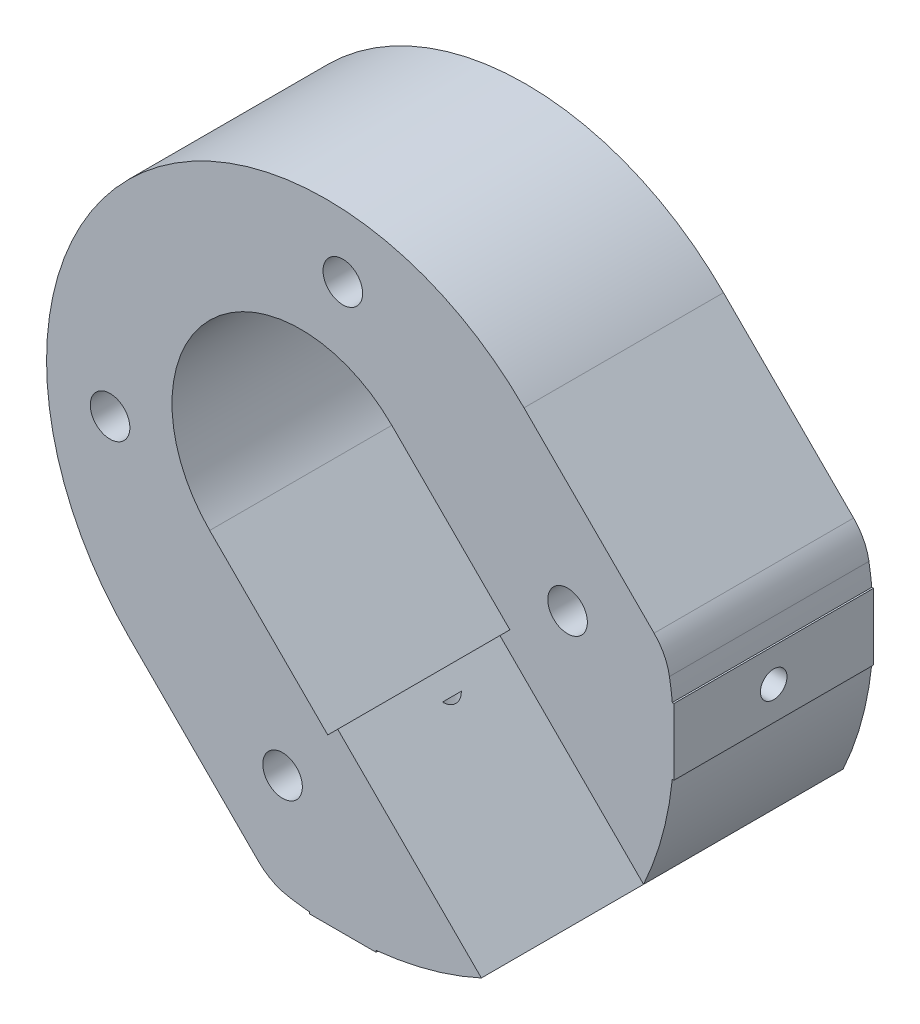
ISO-10303-21;
HEADER;
FILE_DESCRIPTION(('STEP AP214'),'2;1');
FILE_NAME('part.step','',(''),(''),'','','');
FILE_SCHEMA(('AUTOMOTIVE_DESIGN { 1 0 10303 214 1 1 1 1 }'));
ENDSEC;
DATA;
#1=APPLICATION_CONTEXT('core data for automotive mechanical design processes');
#2=APPLICATION_PROTOCOL_DEFINITION('international standard','automotive_design',2000,#1);
#3=PRODUCT_CONTEXT('',#1,'mechanical');
#4=PRODUCT('Part','Part','',(#3));
#5=PRODUCT_RELATED_PRODUCT_CATEGORY('part','',(#4));
#6=PRODUCT_DEFINITION_FORMATION('','',#4);
#7=PRODUCT_DEFINITION_CONTEXT('part definition',#1,'design');
#8=PRODUCT_DEFINITION('design','',#6,#7);
#9=PRODUCT_DEFINITION_SHAPE('','',#8);
#10=(LENGTH_UNIT() NAMED_UNIT(*) SI_UNIT(.MILLI.,.METRE.));
#11=(NAMED_UNIT(*) PLANE_ANGLE_UNIT() SI_UNIT($,.RADIAN.));
#12=(NAMED_UNIT(*) SI_UNIT($,.STERADIAN.) SOLID_ANGLE_UNIT());
#13=UNCERTAINTY_MEASURE_WITH_UNIT(LENGTH_MEASURE(1.E-05),#10,'distance_accuracy_value','');
#14=(GEOMETRIC_REPRESENTATION_CONTEXT(3) GLOBAL_UNCERTAINTY_ASSIGNED_CONTEXT((#13)) GLOBAL_UNIT_ASSIGNED_CONTEXT((#10,
#11,#12)) REPRESENTATION_CONTEXT('',''));
#15=CARTESIAN_POINT('',(0.,0.,0.));
#16=DIRECTION('',(0.,0.,1.));
#17=DIRECTION('',(1.,0.,0.));
#18=AXIS2_PLACEMENT_3D('',#15,#16,#17);
#19=CARTESIAN_POINT('',(20.8397644139722,-45.2349483649082,15.));
#20=DIRECTION('',(-0.707106781186549,-0.707106781186546,0.));
#21=DIRECTION('',(0.707106781186546,-0.707106781186549,0.));
#22=AXIS2_PLACEMENT_3D('',#19,#20,#21);
#23=PLANE('',#22);
#24=DIRECTION('',(0.,0.,-1.));
#25=VECTOR('',#24,1.);
#26=CARTESIAN_POINT('',(20.8397644139722,-45.2349483649082,15.));
#27=LINE('',#26,#25);
#28=CARTESIAN_POINT('',(20.8397644139722,-45.2349483649082,15.));
#29=VERTEX_POINT('',#28);
#30=CARTESIAN_POINT('',(20.8397644139722,-45.2349483649082,-15.));
#31=VERTEX_POINT('',#30);
#32=EDGE_CURVE('E366',#29,#31,#27,.T.);
#33=ORIENTED_EDGE('',*,*,#32,.T.);
#34=DIRECTION('',(-0.707106781186546,0.707106781186549,0.));
#35=VECTOR('',#34,1.);
#36=CARTESIAN_POINT('',(20.8397644139722,-45.2349483649082,-15.));
#37=LINE('',#36,#35);
#38=CARTESIAN_POINT('',(-0.763433331346862,-23.6317506195891,-15.));
#39=VERTEX_POINT('',#38);
#40=EDGE_CURVE('E221',#31,#39,#37,.T.);
#41=ORIENTED_EDGE('',*,*,#40,.T.);
#42=DIRECTION('',(0.,0.,-1.));
#43=VECTOR('',#42,1.);
#44=CARTESIAN_POINT('',(-0.763433331346862,-23.6317506195891,15.));
#45=LINE('',#44,#43);
#46=CARTESIAN_POINT('',(-0.763433331346862,-23.6317506195891,15.));
#47=VERTEX_POINT('',#46);
#48=EDGE_CURVE('E364',#47,#39,#45,.T.);
#49=ORIENTED_EDGE('',*,*,#48,.F.);
#50=DIRECTION('',(-0.707106781186546,0.707106781186549,0.));
#51=VECTOR('',#50,1.);
#52=CARTESIAN_POINT('',(20.8397644139722,-45.2349483649082,15.));
#53=LINE('',#52,#51);
#54=EDGE_CURVE('E286',#29,#47,#53,.T.);
#55=ORIENTED_EDGE('',*,*,#54,.F.);
#56=EDGE_LOOP('',(#33,#41,#49,#55));
#57=FACE_BOUND('',#56,.T.);
#58=CARTESIAN_POINT('',(0.,-24.3951839509359,0.));
#59=DIRECTION('',(-0.707106781186549,-0.707106781186546,0.));
#60=DIRECTION('',(0.707106781186546,-0.707106781186549,0.));
#61=AXIS2_PLACEMENT_3D('',#58,#59,#60);
#62=ELLIPSE('',#61,2.8284271247462,2.);
#63=CARTESIAN_POINT('',(1.40939750906406,-25.80458146,1.41901327035513));
#64=VERTEX_POINT('',#63);
#65=CARTESIAN_POINT('',(1.40939750906406,-25.80458146,-1.41901327035513));
#66=VERTEX_POINT('',#65);
#67=EDGE_CURVE('E212',#64,#66,#62,.F.);
#68=ORIENTED_EDGE('',*,*,#67,.F.);
#69=DIRECTION('',(0.,0.,-1.));
#70=VECTOR('',#69,1.);
#71=CARTESIAN_POINT('',(1.40939750906406,-25.80458146,15.));
#72=LINE('',#71,#70);
#73=EDGE_CURVE('E46',#64,#66,#72,.T.);
#74=ORIENTED_EDGE('',*,*,#73,.T.);
#75=EDGE_LOOP('',(#68,#74));
#76=FACE_BOUND('',#75,.T.);
#77=ADVANCED_FACE('F38',(#57,#76),#23,.F.);
#78=CARTESIAN_POINT('',(5.,-49.5529649406146,15.));
#79=DIRECTION('',(-1.,0.,0.));
#80=DIRECTION('',(0.,-1.,0.));
#81=AXIS2_PLACEMENT_3D('',#78,#79,#80);
#82=PLANE('',#81);
#83=DIRECTION('',(0.,0.,-1.));
#84=VECTOR('',#83,1.);
#85=CARTESIAN_POINT('',(5.,-49.80458146,15.));
#86=LINE('',#85,#84);
#87=CARTESIAN_POINT('',(5.,-49.80458146,15.));
#88=VERTEX_POINT('',#87);
#89=CARTESIAN_POINT('',(5.,-49.80458146,-15.));
#90=VERTEX_POINT('',#89);
#91=EDGE_CURVE('E326',#88,#90,#86,.T.);
#92=ORIENTED_EDGE('',*,*,#91,.T.);
#93=DIRECTION('',(0.,1.,0.));
#94=VECTOR('',#93,1.);
#95=CARTESIAN_POINT('',(5.,-49.5529649406146,-15.));
#96=LINE('',#95,#94);
#97=CARTESIAN_POINT('',(4.99999999999997,-49.5529649406146,-15.));
#98=VERTEX_POINT('',#97);
#99=EDGE_CURVE('E215',#90,#98,#96,.T.);
#100=ORIENTED_EDGE('',*,*,#99,.T.);
#101=DIRECTION('',(0.,0.,-1.));
#102=VECTOR('',#101,1.);
#103=CARTESIAN_POINT('',(4.99999999999997,-49.5529649406146,15.));
#104=LINE('',#103,#102);
#105=CARTESIAN_POINT('',(4.99999999999997,-49.5529649406146,15.));
#106=VERTEX_POINT('',#105);
#107=EDGE_CURVE('E368',#106,#98,#104,.T.);
#108=ORIENTED_EDGE('',*,*,#107,.F.);
#109=DIRECTION('',(0.,1.,0.));
#110=VECTOR('',#109,1.);
#111=CARTESIAN_POINT('',(5.,-49.5529649406146,15.));
#112=LINE('',#111,#110);
#113=EDGE_CURVE('E281',#88,#106,#112,.T.);
#114=ORIENTED_EDGE('',*,*,#113,.F.);
#115=EDGE_LOOP('',(#92,#100,#108,#114));
#116=FACE_BOUND('',#115,.T.);
#117=ADVANCED_FACE('F40',(#116),#82,.F.);
#118=CARTESIAN_POINT('',(0.,0.,15.));
#119=DIRECTION('',(0.,0.,-1.));
#120=DIRECTION('',(-1.,0.,0.));
#121=AXIS2_PLACEMENT_3D('',#118,#119,#120);
#122=CYLINDRICAL_SURFACE('',#121,49.80458146);
#123=ORIENTED_EDGE('',*,*,#107,.T.);
#124=CARTESIAN_POINT('',(0.,0.,-15.));
#125=DIRECTION('',(0.,0.,1.));
#126=DIRECTION('',(1.,0.,0.));
#127=AXIS2_PLACEMENT_3D('',#124,#125,#126);
#128=CIRCLE('',#127,49.80458146);
#129=EDGE_CURVE('E218',#98,#31,#128,.T.);
#130=ORIENTED_EDGE('',*,*,#129,.T.);
#131=ORIENTED_EDGE('',*,*,#32,.F.);
#132=CARTESIAN_POINT('',(0.,0.,15.));
#133=DIRECTION('',(0.,0.,1.));
#134=DIRECTION('',(1.,0.,0.));
#135=AXIS2_PLACEMENT_3D('',#132,#133,#134);
#136=CIRCLE('',#135,49.80458146);
#137=EDGE_CURVE('E284',#106,#29,#136,.T.);
#138=ORIENTED_EDGE('',*,*,#137,.F.);
#139=EDGE_LOOP('',(#123,#130,#131,#138));
#140=FACE_BOUND('',#139,.T.);
#141=ADVANCED_FACE('F396',(#140),#122,.T.);
#142=CARTESIAN_POINT('',(-0.763433331346862,-23.6317506195891,15.));
#143=DIRECTION('',(0.707106781186441,-0.707106781186654,0.));
#144=DIRECTION('',(0.707106781186654,0.707106781186441,0.));
#145=AXIS2_PLACEMENT_3D('',#142,#143,#144);
#146=PLANE('',#145);
#147=ORIENTED_EDGE('',*,*,#48,.T.);
#148=DIRECTION('',(-0.707106781186654,-0.707106781186441,0.));
#149=VECTOR('',#148,1.);
#150=CARTESIAN_POINT('',(-0.763433331346862,-23.6317506195891,-15.));
#151=LINE('',#150,#149);
#152=CARTESIAN_POINT('',(-2.26035594671568,-25.1286732349574,-15.));
#153=VERTEX_POINT('',#152);
#154=EDGE_CURVE('E224',#39,#153,#151,.T.);
#155=ORIENTED_EDGE('',*,*,#154,.T.);
#156=DIRECTION('',(0.,0.,-1.));
#157=VECTOR('',#156,1.);
#158=CARTESIAN_POINT('',(-2.26035594671568,-25.1286732349574,15.));
#159=LINE('',#158,#157);
#160=CARTESIAN_POINT('',(-2.26035594671568,-25.1286732349574,15.));
#161=VERTEX_POINT('',#160);
#162=EDGE_CURVE('E362',#161,#153,#159,.T.);
#163=ORIENTED_EDGE('',*,*,#162,.F.);
#164=DIRECTION('',(-0.707106781186654,-0.707106781186441,0.));
#165=VECTOR('',#164,1.);
#166=CARTESIAN_POINT('',(-0.763433331346862,-23.6317506195891,15.));
#167=LINE('',#166,#165);
#168=EDGE_CURVE('E288',#47,#161,#167,.T.);
#169=ORIENTED_EDGE('',*,*,#168,.F.);
#170=EDGE_LOOP('',(#147,#155,#163,#169));
#171=FACE_BOUND('',#170,.T.);
#172=ADVANCED_FACE('F399',(#171),#146,.F.);
#173=CARTESIAN_POINT('',(-2.26035594671568,-25.1286732349574,15.));
#174=DIRECTION('',(-0.707106781186549,-0.707106781186546,0.));
#175=DIRECTION('',(0.707106781186546,-0.707106781186549,0.));
#176=AXIS2_PLACEMENT_3D('',#173,#174,#175);
#177=PLANE('',#176);
#178=ORIENTED_EDGE('',*,*,#162,.T.);
#179=DIRECTION('',(-0.707106781186546,0.707106781186549,0.));
#180=VECTOR('',#179,1.);
#181=CARTESIAN_POINT('',(-2.26035594671568,-25.1286732349574,-15.));
#182=LINE('',#181,#180);
#183=CARTESIAN_POINT('',(-20.0175175344704,-7.3715116472027,-15.));
#184=VERTEX_POINT('',#183);
#185=EDGE_CURVE('E227',#153,#184,#182,.T.);
#186=ORIENTED_EDGE('',*,*,#185,.T.);
#187=DIRECTION('',(0.,0.,-1.));
#188=VECTOR('',#187,1.);
#189=CARTESIAN_POINT('',(-20.0175175344704,-7.3715116472027,15.));
#190=LINE('',#189,#188);
#191=CARTESIAN_POINT('',(-20.0175175344704,-7.3715116472027,15.));
#192=VERTEX_POINT('',#191);
#193=EDGE_CURVE('E360',#192,#184,#190,.T.);
#194=ORIENTED_EDGE('',*,*,#193,.F.);
#195=DIRECTION('',(-0.707106781186546,0.707106781186549,0.));
#196=VECTOR('',#195,1.);
#197=CARTESIAN_POINT('',(-2.26035594671568,-25.1286732349574,15.));
#198=LINE('',#197,#196);
#199=EDGE_CURVE('E290',#161,#192,#198,.T.);
#200=ORIENTED_EDGE('',*,*,#199,.F.);
#201=EDGE_LOOP('',(#178,#186,#194,#200));
#202=FACE_BOUND('',#201,.T.);
#203=ADVANCED_FACE('F406',(#202),#177,.F.);
#204=CARTESIAN_POINT('',(-6.3230029436338,6.3230029436338,15.));
#205=DIRECTION('',(0.,0.,-1.));
#206=DIRECTION('',(-1.,0.,0.));
#207=AXIS2_PLACEMENT_3D('',#204,#205,#206);
#208=CYLINDRICAL_SURFACE('',#207,19.3669682644773);
#209=ORIENTED_EDGE('',*,*,#193,.T.);
#210=CARTESIAN_POINT('',(-6.3230029436338,6.3230029436338,-15.));
#211=DIRECTION('',(0.,0.,-1.));
#212=DIRECTION('',(1.,0.,0.));
#213=AXIS2_PLACEMENT_3D('',#210,#211,#212);
#214=CIRCLE('',#213,19.3669682644773);
#215=CARTESIAN_POINT('',(7.37151164720273,20.0175175344703,-15.));
#216=VERTEX_POINT('',#215);
#217=EDGE_CURVE('E230',#184,#216,#214,.T.);
#218=ORIENTED_EDGE('',*,*,#217,.T.);
#219=DIRECTION('',(0.,0.,-1.));
#220=VECTOR('',#219,1.);
#221=CARTESIAN_POINT('',(7.37151164720273,20.0175175344703,15.));
#222=LINE('',#221,#220);
#223=CARTESIAN_POINT('',(7.37151164720273,20.0175175344703,15.));
#224=VERTEX_POINT('',#223);
#225=EDGE_CURVE('E358',#224,#216,#222,.T.);
#226=ORIENTED_EDGE('',*,*,#225,.F.);
#227=CARTESIAN_POINT('',(-6.3230029436338,6.3230029436338,15.));
#228=DIRECTION('',(0.,0.,-1.));
#229=DIRECTION('',(1.,0.,0.));
#230=AXIS2_PLACEMENT_3D('',#227,#228,#229);
#231=CIRCLE('',#230,19.3669682644773);
#232=EDGE_CURVE('E292',#192,#224,#231,.T.);
#233=ORIENTED_EDGE('',*,*,#232,.F.);
#234=EDGE_LOOP('',(#209,#218,#226,#233));
#235=FACE_BOUND('',#234,.T.);
#236=ADVANCED_FACE('F497',(#235),#208,.F.);
#237=CARTESIAN_POINT('',(25.1286732349579,2.26035594671519,15.));
#238=DIRECTION('',(0.707106781186548,0.707106781186547,0.));
#239=DIRECTION('',(-0.707106781186547,0.707106781186548,0.));
#240=AXIS2_PLACEMENT_3D('',#237,#238,#239);
#241=PLANE('',#240);
#242=ORIENTED_EDGE('',*,*,#225,.T.);
#243=DIRECTION('',(0.707106781186548,-0.707106781186548,0.));
#244=VECTOR('',#243,1.);
#245=CARTESIAN_POINT('',(25.1286732349579,2.26035594671519,-15.));
#246=LINE('',#245,#244);
#247=CARTESIAN_POINT('',(25.1286732349579,2.26035594671519,-15.));
#248=VERTEX_POINT('',#247);
#249=EDGE_CURVE('E233',#216,#248,#246,.T.);
#250=ORIENTED_EDGE('',*,*,#249,.T.);
#251=DIRECTION('',(0.,0.,-1.));
#252=VECTOR('',#251,1.);
#253=CARTESIAN_POINT('',(25.1286732349579,2.26035594671519,15.));
#254=LINE('',#253,#252);
#255=CARTESIAN_POINT('',(25.1286732349579,2.26035594671519,15.));
#256=VERTEX_POINT('',#255);
#257=EDGE_CURVE('E356',#256,#248,#254,.T.);
#258=ORIENTED_EDGE('',*,*,#257,.F.);
#259=DIRECTION('',(0.707106781186548,-0.707106781186548,0.));
#260=VECTOR('',#259,1.);
#261=CARTESIAN_POINT('',(25.1286732349579,2.26035594671519,15.));
#262=LINE('',#261,#260);
#263=EDGE_CURVE('E294',#224,#256,#262,.T.);
#264=ORIENTED_EDGE('',*,*,#263,.F.);
#265=EDGE_LOOP('',(#242,#250,#258,#264));
#266=FACE_BOUND('',#265,.T.);
#267=ADVANCED_FACE('F492',(#266),#241,.F.);
#268=CARTESIAN_POINT('',(23.6317506195891,0.763433331346767,15.));
#269=DIRECTION('',(0.707106781186456,-0.707106781186639,0.));
#270=DIRECTION('',(0.707106781186639,0.707106781186456,0.));
#271=AXIS2_PLACEMENT_3D('',#268,#269,#270);
#272=PLANE('',#271);
#273=ORIENTED_EDGE('',*,*,#257,.T.);
#274=DIRECTION('',(-0.707106781186639,-0.707106781186456,0.));
#275=VECTOR('',#274,1.);
#276=CARTESIAN_POINT('',(23.6317506195891,0.763433331346767,-15.));
#277=LINE('',#276,#275);
#278=CARTESIAN_POINT('',(23.6317506195891,0.763433331346767,-15.));
#279=VERTEX_POINT('',#278);
#280=EDGE_CURVE('E236',#248,#279,#277,.T.);
#281=ORIENTED_EDGE('',*,*,#280,.T.);
#282=DIRECTION('',(0.,0.,-1.));
#283=VECTOR('',#282,1.);
#284=CARTESIAN_POINT('',(23.6317506195891,0.763433331346767,15.));
#285=LINE('',#284,#283);
#286=CARTESIAN_POINT('',(23.6317506195891,0.763433331346767,15.));
#287=VERTEX_POINT('',#286);
#288=EDGE_CURVE('E354',#287,#279,#285,.T.);
#289=ORIENTED_EDGE('',*,*,#288,.F.);
#290=DIRECTION('',(-0.707106781186639,-0.707106781186456,0.));
#291=VECTOR('',#290,1.);
#292=CARTESIAN_POINT('',(23.6317506195891,0.763433331346767,15.));
#293=LINE('',#292,#291);
#294=EDGE_CURVE('E296',#256,#287,#293,.T.);
#295=ORIENTED_EDGE('',*,*,#294,.F.);
#296=EDGE_LOOP('',(#273,#281,#289,#295));
#297=FACE_BOUND('',#296,.T.);
#298=ADVANCED_FACE('F487',(#297),#272,.F.);
#299=CARTESIAN_POINT('',(45.2349483649081,-20.8397644139724,15.));
#300=DIRECTION('',(0.707106781186549,0.707106781186546,0.));
#301=DIRECTION('',(-0.707106781186546,0.707106781186549,0.));
#302=AXIS2_PLACEMENT_3D('',#299,#300,#301);
#303=PLANE('',#302);
#304=DIRECTION('',(0.,0.,-1.));
#305=VECTOR('',#304,1.);
#306=CARTESIAN_POINT('',(25.80458146,-1.40939750906419,15.));
#307=LINE('',#306,#305);
#308=CARTESIAN_POINT('',(25.80458146,-1.40939750906419,1.41901327035503));
#309=VERTEX_POINT('',#308);
#310=CARTESIAN_POINT('',(25.80458146,-1.40939750906419,-1.41901327035503));
#311=VERTEX_POINT('',#310);
#312=EDGE_CURVE('E11',#309,#311,#307,.T.);
#313=ORIENTED_EDGE('',*,*,#312,.F.);
#314=CARTESIAN_POINT('',(24.3951839509358,0.,0.));
#315=DIRECTION('',(0.707106781186549,0.707106781186546,0.));
#316=DIRECTION('',(0.707106781186546,-0.707106781186549,0.));
#317=AXIS2_PLACEMENT_3D('',#314,#315,#316);
#318=ELLIPSE('',#317,2.82842712474619,2.);
#319=EDGE_CURVE('E201',#309,#311,#318,.T.);
#320=ORIENTED_EDGE('',*,*,#319,.T.);
#321=EDGE_LOOP('',(#313,#320));
#322=FACE_BOUND('',#321,.T.);
#323=ORIENTED_EDGE('',*,*,#288,.T.);
#324=DIRECTION('',(0.707106781186546,-0.707106781186549,0.));
#325=VECTOR('',#324,1.);
#326=CARTESIAN_POINT('',(45.2349483649081,-20.8397644139724,-15.));
#327=LINE('',#326,#325);
#328=CARTESIAN_POINT('',(45.2349483649081,-20.8397644139724,-15.));
#329=VERTEX_POINT('',#328);
#330=EDGE_CURVE('E239',#279,#329,#327,.T.);
#331=ORIENTED_EDGE('',*,*,#330,.T.);
#332=DIRECTION('',(0.,0.,-1.));
#333=VECTOR('',#332,1.);
#334=CARTESIAN_POINT('',(45.2349483649081,-20.8397644139724,15.));
#335=LINE('',#334,#333);
#336=CARTESIAN_POINT('',(45.2349483649081,-20.8397644139724,15.));
#337=VERTEX_POINT('',#336);
#338=EDGE_CURVE('E352',#337,#329,#335,.T.);
#339=ORIENTED_EDGE('',*,*,#338,.F.);
#340=DIRECTION('',(0.707106781186546,-0.707106781186549,0.));
#341=VECTOR('',#340,1.);
#342=CARTESIAN_POINT('',(45.2349483649081,-20.8397644139724,15.));
#343=LINE('',#342,#341);
#344=EDGE_CURVE('E298',#287,#337,#343,.T.);
#345=ORIENTED_EDGE('',*,*,#344,.F.);
#346=EDGE_LOOP('',(#323,#331,#339,#345));
#347=FACE_BOUND('',#346,.T.);
#348=ADVANCED_FACE('F204',(#322,#347),#303,.F.);
#349=CARTESIAN_POINT('',(0.,0.,15.));
#350=DIRECTION('',(0.,0.,-1.));
#351=DIRECTION('',(-1.,0.,0.));
#352=AXIS2_PLACEMENT_3D('',#349,#350,#351);
#353=CYLINDRICAL_SURFACE('',#352,49.80458146);
#354=ORIENTED_EDGE('',*,*,#338,.T.);
#355=CARTESIAN_POINT('',(0.,0.,-15.));
#356=DIRECTION('',(0.,0.,1.));
#357=DIRECTION('',(-1.,0.,0.));
#358=AXIS2_PLACEMENT_3D('',#355,#356,#357);
#359=CIRCLE('',#358,49.80458146);
#360=CARTESIAN_POINT('',(49.5529649406146,-5.,-15.));
#361=VERTEX_POINT('',#360);
#362=EDGE_CURVE('E242',#329,#361,#359,.T.);
#363=ORIENTED_EDGE('',*,*,#362,.T.);
#364=DIRECTION('',(0.,0.,-1.));
#365=VECTOR('',#364,1.);
#366=CARTESIAN_POINT('',(49.5529649406146,-5.,15.));
#367=LINE('',#366,#365);
#368=CARTESIAN_POINT('',(49.5529649406146,-5.,15.));
#369=VERTEX_POINT('',#368);
#370=EDGE_CURVE('E350',#369,#361,#367,.T.);
#371=ORIENTED_EDGE('',*,*,#370,.F.);
#372=CARTESIAN_POINT('',(0.,0.,15.));
#373=DIRECTION('',(0.,0.,1.));
#374=DIRECTION('',(-1.,0.,0.));
#375=AXIS2_PLACEMENT_3D('',#372,#373,#374);
#376=CIRCLE('',#375,49.80458146);
#377=EDGE_CURVE('E300',#337,#369,#376,.T.);
#378=ORIENTED_EDGE('',*,*,#377,.F.);
#379=EDGE_LOOP('',(#354,#363,#371,#378));
#380=FACE_BOUND('',#379,.T.);
#381=ADVANCED_FACE('F479',(#380),#353,.T.);
#382=CARTESIAN_POINT('',(49.80458146,-5.,15.));
#383=DIRECTION('',(0.,1.,0.));
#384=DIRECTION('',(-1.,0.,0.));
#385=AXIS2_PLACEMENT_3D('',#382,#383,#384);
#386=PLANE('',#385);
#387=ORIENTED_EDGE('',*,*,#370,.T.);
#388=DIRECTION('',(1.,0.,0.));
#389=VECTOR('',#388,1.);
#390=CARTESIAN_POINT('',(49.80458146,-5.,-15.));
#391=LINE('',#390,#389);
#392=CARTESIAN_POINT('',(49.80458146,-5.,-15.));
#393=VERTEX_POINT('',#392);
#394=EDGE_CURVE('E245',#361,#393,#391,.T.);
#395=ORIENTED_EDGE('',*,*,#394,.T.);
#396=DIRECTION('',(0.,0.,-1.));
#397=VECTOR('',#396,1.);
#398=CARTESIAN_POINT('',(49.80458146,-5.,15.));
#399=LINE('',#398,#397);
#400=CARTESIAN_POINT('',(49.80458146,-5.,15.));
#401=VERTEX_POINT('',#400);
#402=EDGE_CURVE('E348',#401,#393,#399,.T.);
#403=ORIENTED_EDGE('',*,*,#402,.F.);
#404=DIRECTION('',(1.,0.,0.));
#405=VECTOR('',#404,1.);
#406=CARTESIAN_POINT('',(49.80458146,-5.,15.));
#407=LINE('',#406,#405);
#408=EDGE_CURVE('E302',#369,#401,#407,.T.);
#409=ORIENTED_EDGE('',*,*,#408,.F.);
#410=EDGE_LOOP('',(#387,#395,#403,#409));
#411=FACE_BOUND('',#410,.T.);
#412=ADVANCED_FACE('F474',(#411),#386,.F.);
#413=CARTESIAN_POINT('',(49.80458146,5.,15.));
#414=DIRECTION('',(-1.,0.,0.));
#415=DIRECTION('',(0.,0.,1.));
#416=AXIS2_PLACEMENT_3D('',#413,#414,#415);
#417=PLANE('',#416);
#418=CARTESIAN_POINT('',(49.80458146,0.,0.));
#419=DIRECTION('',(1.,0.,0.));
#420=DIRECTION('',(0.,0.,-1.));
#421=AXIS2_PLACEMENT_3D('',#418,#419,#420);
#422=CIRCLE('',#421,2.);
#423=CARTESIAN_POINT('',(49.80458146,0.,-2.));
#424=VERTEX_POINT('',#423);
#425=EDGE_CURVE('E202',#424,#424,#422,.T.);
#426=ORIENTED_EDGE('',*,*,#425,.F.);
#427=EDGE_LOOP('',(#426));
#428=FACE_BOUND('',#427,.T.);
#429=ORIENTED_EDGE('',*,*,#402,.T.);
#430=DIRECTION('',(0.,1.,0.));
#431=VECTOR('',#430,1.);
#432=CARTESIAN_POINT('',(49.80458146,5.,-15.));
#433=LINE('',#432,#431);
#434=CARTESIAN_POINT('',(49.80458146,5.,-15.));
#435=VERTEX_POINT('',#434);
#436=EDGE_CURVE('E248',#393,#435,#433,.T.);
#437=ORIENTED_EDGE('',*,*,#436,.T.);
#438=DIRECTION('',(0.,0.,-1.));
#439=VECTOR('',#438,1.);
#440=CARTESIAN_POINT('',(49.80458146,5.,15.));
#441=LINE('',#440,#439);
#442=CARTESIAN_POINT('',(49.80458146,5.,15.));
#443=VERTEX_POINT('',#442);
#444=EDGE_CURVE('E346',#443,#435,#441,.T.);
#445=ORIENTED_EDGE('',*,*,#444,.F.);
#446=DIRECTION('',(0.,1.,0.));
#447=VECTOR('',#446,1.);
#448=CARTESIAN_POINT('',(49.80458146,5.,15.));
#449=LINE('',#448,#447);
#450=EDGE_CURVE('E304',#401,#443,#449,.T.);
#451=ORIENTED_EDGE('',*,*,#450,.F.);
#452=EDGE_LOOP('',(#429,#437,#445,#451));
#453=FACE_BOUND('',#452,.T.);
#454=ADVANCED_FACE('F469',(#428,#453),#417,.F.);
#455=CARTESIAN_POINT('',(49.5529649406146,5.,15.));
#456=DIRECTION('',(0.,-1.,0.));
#457=DIRECTION('',(1.,0.,0.));
#458=AXIS2_PLACEMENT_3D('',#455,#456,#457);
#459=PLANE('',#458);
#460=ORIENTED_EDGE('',*,*,#444,.T.);
#461=DIRECTION('',(-1.,0.,0.));
#462=VECTOR('',#461,1.);
#463=CARTESIAN_POINT('',(49.5529649406146,5.,-15.));
#464=LINE('',#463,#462);
#465=CARTESIAN_POINT('',(49.5529649406146,5.,-15.));
#466=VERTEX_POINT('',#465);
#467=EDGE_CURVE('E251',#435,#466,#464,.T.);
#468=ORIENTED_EDGE('',*,*,#467,.T.);
#469=DIRECTION('',(0.,0.,-1.));
#470=VECTOR('',#469,1.);
#471=CARTESIAN_POINT('',(49.5529649406146,5.,15.));
#472=LINE('',#471,#470);
#473=CARTESIAN_POINT('',(49.5529649406146,5.,15.));
#474=VERTEX_POINT('',#473);
#475=EDGE_CURVE('E344',#474,#466,#472,.T.);
#476=ORIENTED_EDGE('',*,*,#475,.F.);
#477=DIRECTION('',(-1.,0.,0.));
#478=VECTOR('',#477,1.);
#479=CARTESIAN_POINT('',(49.5529649406146,5.,15.));
#480=LINE('',#479,#478);
#481=EDGE_CURVE('E306',#443,#474,#480,.T.);
#482=ORIENTED_EDGE('',*,*,#481,.F.);
#483=EDGE_LOOP('',(#460,#468,#476,#482));
#484=FACE_BOUND('',#483,.T.);
#485=ADVANCED_FACE('F464',(#484),#459,.F.);
#486=CARTESIAN_POINT('',(0.,0.,15.));
#487=DIRECTION('',(0.,0.,-1.));
#488=DIRECTION('',(-1.,0.,0.));
#489=AXIS2_PLACEMENT_3D('',#486,#487,#488);
#490=CYLINDRICAL_SURFACE('',#489,49.80458146);
#491=ORIENTED_EDGE('',*,*,#475,.T.);
#492=CARTESIAN_POINT('',(0.,0.,-15.));
#493=DIRECTION('',(0.,0.,1.));
#494=DIRECTION('',(1.,0.,0.));
#495=AXIS2_PLACEMENT_3D('',#492,#493,#494);
#496=CIRCLE('',#495,49.80458146);
#497=CARTESIAN_POINT('',(49.1286137444415,8.17775311165887,-15.));
#498=VERTEX_POINT('',#497);
#499=EDGE_CURVE('E254',#466,#498,#496,.T.);
#500=ORIENTED_EDGE('',*,*,#499,.T.);
#501=DIRECTION('',(0.,0.,-1.));
#502=VECTOR('',#501,1.);
#503=CARTESIAN_POINT('',(49.1286137444415,8.17775311165887,15.));
#504=LINE('',#503,#502);
#505=CARTESIAN_POINT('',(49.1286137444415,8.17775311165887,15.));
#506=VERTEX_POINT('',#505);
#507=EDGE_CURVE('E342',#506,#498,#504,.T.);
#508=ORIENTED_EDGE('',*,*,#507,.F.);
#509=CARTESIAN_POINT('',(0.,0.,15.));
#510=DIRECTION('',(0.,0.,1.));
#511=DIRECTION('',(1.,0.,0.));
#512=AXIS2_PLACEMENT_3D('',#509,#510,#511);
#513=CIRCLE('',#512,49.80458146);
#514=EDGE_CURVE('E308',#474,#506,#513,.T.);
#515=ORIENTED_EDGE('',*,*,#514,.F.);
#516=EDGE_LOOP('',(#491,#500,#508,#515));
#517=FACE_BOUND('',#516,.T.);
#518=ADVANCED_FACE('F459',(#517),#490,.T.);
#519=CARTESIAN_POINT('',(40.9730439340301,6.82020948664688,15.));
#520=DIRECTION('',(0.,0.,-1.));
#521=DIRECTION('',(-1.,0.,0.));
#522=AXIS2_PLACEMENT_3D('',#519,#520,#521);
#523=CYLINDRICAL_SURFACE('',#522,8.26778347722678);
#524=ORIENTED_EDGE('',*,*,#507,.T.);
#525=CARTESIAN_POINT('',(40.9730439340301,6.82020948664688,-15.));
#526=DIRECTION('',(0.,0.,1.));
#527=DIRECTION('',(1.,0.,0.));
#528=AXIS2_PLACEMENT_3D('',#525,#526,#527);
#529=CIRCLE('',#528,8.26778347722678);
#530=CARTESIAN_POINT('',(46.8192496961593,12.666415248776,-15.));
#531=VERTEX_POINT('',#530);
#532=EDGE_CURVE('E257',#498,#531,#529,.T.);
#533=ORIENTED_EDGE('',*,*,#532,.T.);
#534=DIRECTION('',(0.,0.,-1.));
#535=VECTOR('',#534,1.);
#536=CARTESIAN_POINT('',(46.8192496961593,12.666415248776,15.));
#537=LINE('',#536,#535);
#538=CARTESIAN_POINT('',(46.8192496961593,12.666415248776,15.));
#539=VERTEX_POINT('',#538);
#540=EDGE_CURVE('E340',#539,#531,#537,.T.);
#541=ORIENTED_EDGE('',*,*,#540,.F.);
#542=CARTESIAN_POINT('',(40.9730439340301,6.82020948664688,15.));
#543=DIRECTION('',(0.,0.,1.));
#544=DIRECTION('',(1.,0.,0.));
#545=AXIS2_PLACEMENT_3D('',#542,#543,#544);
#546=CIRCLE('',#545,8.26778347722678);
#547=EDGE_CURVE('E310',#506,#539,#546,.T.);
#548=ORIENTED_EDGE('',*,*,#547,.F.);
#549=EDGE_LOOP('',(#524,#533,#541,#548));
#550=FACE_BOUND('',#549,.T.);
#551=ADVANCED_FACE('F454',(#550),#523,.T.);
#552=CARTESIAN_POINT('',(46.8192496961593,12.666415248776,15.));
#553=DIRECTION('',(-0.707106781186549,-0.707106781186546,0.));
#554=DIRECTION('',(0.707106781186546,-0.707106781186549,0.));
#555=AXIS2_PLACEMENT_3D('',#552,#553,#554);
#556=PLANE('',#555);
#557=ORIENTED_EDGE('',*,*,#540,.T.);
#558=DIRECTION('',(-0.707106781186546,0.707106781186549,0.));
#559=VECTOR('',#558,1.);
#560=CARTESIAN_POINT('',(46.8192496961593,12.666415248776,-15.));
#561=LINE('',#560,#559);
#562=CARTESIAN_POINT('',(27.2537012259851,32.2319637189503,-15.));
#563=VERTEX_POINT('',#562);
#564=EDGE_CURVE('E260',#531,#563,#561,.T.);
#565=ORIENTED_EDGE('',*,*,#564,.T.);
#566=DIRECTION('',(0.,0.,-1.));
#567=VECTOR('',#566,1.);
#568=CARTESIAN_POINT('',(27.2537012259851,32.2319637189503,15.));
#569=LINE('',#568,#567);
#570=CARTESIAN_POINT('',(27.2537012259851,32.2319637189503,15.));
#571=VERTEX_POINT('',#570);
#572=EDGE_CURVE('E338',#571,#563,#569,.T.);
#573=ORIENTED_EDGE('',*,*,#572,.F.);
#574=DIRECTION('',(-0.707106781186546,0.707106781186549,0.));
#575=VECTOR('',#574,1.);
#576=CARTESIAN_POINT('',(46.8192496961593,12.666415248776,15.));
#577=LINE('',#576,#575);
#578=EDGE_CURVE('E312',#539,#571,#577,.T.);
#579=ORIENTED_EDGE('',*,*,#578,.F.);
#580=EDGE_LOOP('',(#557,#565,#573,#579));
#581=FACE_BOUND('',#580,.T.);
#582=ADVANCED_FACE('F449',(#581),#556,.F.);
#583=CARTESIAN_POINT('',(-2.48913124648268,2.48913124648267,15.));
#584=DIRECTION('',(0.,0.,-1.));
#585=DIRECTION('',(-1.,0.,0.));
#586=AXIS2_PLACEMENT_3D('',#583,#584,#585);
#587=CYLINDRICAL_SURFACE('',#586,42.0627170659547);
#588=ORIENTED_EDGE('',*,*,#572,.T.);
#589=CARTESIAN_POINT('',(-2.48913124648268,2.48913124648267,-15.));
#590=DIRECTION('',(0.,0.,1.));
#591=DIRECTION('',(1.,0.,0.));
#592=AXIS2_PLACEMENT_3D('',#589,#590,#591);
#593=CIRCLE('',#592,42.0627170659547);
#594=CARTESIAN_POINT('',(-32.2319637189504,-27.253701225985,-15.));
#595=VERTEX_POINT('',#594);
#596=EDGE_CURVE('E263',#563,#595,#593,.T.);
#597=ORIENTED_EDGE('',*,*,#596,.T.);
#598=DIRECTION('',(0.,0.,-1.));
#599=VECTOR('',#598,1.);
#600=CARTESIAN_POINT('',(-32.2319637189504,-27.253701225985,15.));
#601=LINE('',#600,#599);
#602=CARTESIAN_POINT('',(-32.2319637189504,-27.253701225985,15.));
#603=VERTEX_POINT('',#602);
#604=EDGE_CURVE('E336',#603,#595,#601,.T.);
#605=ORIENTED_EDGE('',*,*,#604,.F.);
#606=CARTESIAN_POINT('',(-2.48913124648268,2.48913124648267,15.));
#607=DIRECTION('',(0.,0.,1.));
#608=DIRECTION('',(1.,0.,0.));
#609=AXIS2_PLACEMENT_3D('',#606,#607,#608);
#610=CIRCLE('',#609,42.0627170659547);
#611=EDGE_CURVE('E314',#571,#603,#610,.T.);
#612=ORIENTED_EDGE('',*,*,#611,.F.);
#613=EDGE_LOOP('',(#588,#597,#605,#612));
#614=FACE_BOUND('',#613,.T.);
#615=ADVANCED_FACE('F444',(#614),#587,.T.);
#616=CARTESIAN_POINT('',(-12.6664152487762,-46.8192496961593,15.));
#617=DIRECTION('',(0.707106781186548,0.707106781186547,0.));
#618=DIRECTION('',(-0.707106781186547,0.707106781186548,0.));
#619=AXIS2_PLACEMENT_3D('',#616,#617,#618);
#620=PLANE('',#619);
#621=ORIENTED_EDGE('',*,*,#604,.T.);
#622=DIRECTION('',(0.707106781186547,-0.707106781186548,0.));
#623=VECTOR('',#622,1.);
#624=CARTESIAN_POINT('',(-12.6664152487762,-46.8192496961593,-15.));
#625=LINE('',#624,#623);
#626=CARTESIAN_POINT('',(-12.6664152487762,-46.8192496961593,-15.));
#627=VERTEX_POINT('',#626);
#628=EDGE_CURVE('E266',#595,#627,#625,.T.);
#629=ORIENTED_EDGE('',*,*,#628,.T.);
#630=DIRECTION('',(0.,0.,-1.));
#631=VECTOR('',#630,1.);
#632=CARTESIAN_POINT('',(-12.6664152487762,-46.8192496961593,15.));
#633=LINE('',#632,#631);
#634=CARTESIAN_POINT('',(-12.6664152487762,-46.8192496961593,15.));
#635=VERTEX_POINT('',#634);
#636=EDGE_CURVE('E334',#635,#627,#633,.T.);
#637=ORIENTED_EDGE('',*,*,#636,.F.);
#638=DIRECTION('',(0.707106781186547,-0.707106781186548,0.));
#639=VECTOR('',#638,1.);
#640=CARTESIAN_POINT('',(-12.6664152487762,-46.8192496961593,15.));
#641=LINE('',#640,#639);
#642=EDGE_CURVE('E316',#603,#635,#641,.T.);
#643=ORIENTED_EDGE('',*,*,#642,.F.);
#644=EDGE_LOOP('',(#621,#629,#637,#643));
#645=FACE_BOUND('',#644,.T.);
#646=ADVANCED_FACE('F439',(#645),#620,.F.);
#647=CARTESIAN_POINT('',(-6.82020948664704,-40.9730439340301,15.));
#648=DIRECTION('',(0.,0.,-1.));
#649=DIRECTION('',(-1.,0.,0.));
#650=AXIS2_PLACEMENT_3D('',#647,#648,#649);
#651=CYLINDRICAL_SURFACE('',#650,8.26778347722678);
#652=ORIENTED_EDGE('',*,*,#636,.T.);
#653=CARTESIAN_POINT('',(-6.82020948664704,-40.9730439340301,-15.));
#654=DIRECTION('',(0.,0.,1.));
#655=DIRECTION('',(-1.,0.,0.));
#656=AXIS2_PLACEMENT_3D('',#653,#654,#655);
#657=CIRCLE('',#656,8.26778347722678);
#658=CARTESIAN_POINT('',(-8.17775311165906,-49.1286137444415,-15.));
#659=VERTEX_POINT('',#658);
#660=EDGE_CURVE('E269',#627,#659,#657,.T.);
#661=ORIENTED_EDGE('',*,*,#660,.T.);
#662=DIRECTION('',(0.,0.,-1.));
#663=VECTOR('',#662,1.);
#664=CARTESIAN_POINT('',(-8.17775311165906,-49.1286137444415,15.));
#665=LINE('',#664,#663);
#666=CARTESIAN_POINT('',(-8.17775311165906,-49.1286137444415,15.));
#667=VERTEX_POINT('',#666);
#668=EDGE_CURVE('E332',#667,#659,#665,.T.);
#669=ORIENTED_EDGE('',*,*,#668,.F.);
#670=CARTESIAN_POINT('',(-6.82020948664704,-40.9730439340301,15.));
#671=DIRECTION('',(0.,0.,1.));
#672=DIRECTION('',(-1.,0.,0.));
#673=AXIS2_PLACEMENT_3D('',#670,#671,#672);
#674=CIRCLE('',#673,8.26778347722678);
#675=EDGE_CURVE('E318',#635,#667,#674,.T.);
#676=ORIENTED_EDGE('',*,*,#675,.F.);
#677=EDGE_LOOP('',(#652,#661,#669,#676));
#678=FACE_BOUND('',#677,.T.);
#679=ADVANCED_FACE('F434',(#678),#651,.T.);
#680=CARTESIAN_POINT('',(0.,0.,15.));
#681=DIRECTION('',(0.,0.,-1.));
#682=DIRECTION('',(-1.,0.,0.));
#683=AXIS2_PLACEMENT_3D('',#680,#681,#682);
#684=CYLINDRICAL_SURFACE('',#683,49.80458146);
#685=ORIENTED_EDGE('',*,*,#668,.T.);
#686=CARTESIAN_POINT('',(0.,0.,-15.));
#687=DIRECTION('',(0.,0.,1.));
#688=DIRECTION('',(1.,0.,0.));
#689=AXIS2_PLACEMENT_3D('',#686,#687,#688);
#690=CIRCLE('',#689,49.80458146);
#691=CARTESIAN_POINT('',(-5.,-49.5529649406146,-15.));
#692=VERTEX_POINT('',#691);
#693=EDGE_CURVE('E272',#659,#692,#690,.T.);
#694=ORIENTED_EDGE('',*,*,#693,.T.);
#695=DIRECTION('',(0.,0.,-1.));
#696=VECTOR('',#695,1.);
#697=CARTESIAN_POINT('',(-5.,-49.5529649406146,15.));
#698=LINE('',#697,#696);
#699=CARTESIAN_POINT('',(-5.,-49.5529649406146,15.));
#700=VERTEX_POINT('',#699);
#701=EDGE_CURVE('E330',#700,#692,#698,.T.);
#702=ORIENTED_EDGE('',*,*,#701,.F.);
#703=CARTESIAN_POINT('',(0.,0.,15.));
#704=DIRECTION('',(0.,0.,1.));
#705=DIRECTION('',(1.,0.,0.));
#706=AXIS2_PLACEMENT_3D('',#703,#704,#705);
#707=CIRCLE('',#706,49.80458146);
#708=EDGE_CURVE('E320',#667,#700,#707,.T.);
#709=ORIENTED_EDGE('',*,*,#708,.F.);
#710=EDGE_LOOP('',(#685,#694,#702,#709));
#711=FACE_BOUND('',#710,.T.);
#712=ADVANCED_FACE('F428',(#711),#684,.T.);
#713=CARTESIAN_POINT('',(-5.,-49.80458146,15.));
#714=DIRECTION('',(1.,0.,0.));
#715=DIRECTION('',(0.,1.,0.));
#716=AXIS2_PLACEMENT_3D('',#713,#714,#715);
#717=PLANE('',#716);
#718=ORIENTED_EDGE('',*,*,#701,.T.);
#719=DIRECTION('',(0.,-1.,0.));
#720=VECTOR('',#719,1.);
#721=CARTESIAN_POINT('',(-5.,-49.80458146,-15.));
#722=LINE('',#721,#720);
#723=CARTESIAN_POINT('',(-5.,-49.80458146,-15.));
#724=VERTEX_POINT('',#723);
#725=EDGE_CURVE('E275',#692,#724,#722,.T.);
#726=ORIENTED_EDGE('',*,*,#725,.T.);
#727=DIRECTION('',(0.,0.,-1.));
#728=VECTOR('',#727,1.);
#729=CARTESIAN_POINT('',(-5.,-49.80458146,15.));
#730=LINE('',#729,#728);
#731=CARTESIAN_POINT('',(-5.,-49.80458146,15.));
#732=VERTEX_POINT('',#731);
#733=EDGE_CURVE('E328',#732,#724,#730,.T.);
#734=ORIENTED_EDGE('',*,*,#733,.F.);
#735=DIRECTION('',(0.,-1.,0.));
#736=VECTOR('',#735,1.);
#737=CARTESIAN_POINT('',(-5.,-49.80458146,15.));
#738=LINE('',#737,#736);
#739=EDGE_CURVE('E322',#700,#732,#738,.T.);
#740=ORIENTED_EDGE('',*,*,#739,.F.);
#741=EDGE_LOOP('',(#718,#726,#734,#740));
#742=FACE_BOUND('',#741,.T.);
#743=ADVANCED_FACE('F508',(#742),#717,.F.);
#744=CARTESIAN_POINT('',(5.,-49.80458146,15.));
#745=DIRECTION('',(0.,1.,0.));
#746=DIRECTION('',(0.,0.,1.));
#747=AXIS2_PLACEMENT_3D('',#744,#745,#746);
#748=PLANE('',#747);
#749=CARTESIAN_POINT('',(0.,-49.80458146,0.));
#750=DIRECTION('',(0.,1.,0.));
#751=DIRECTION('',(-1.,0.,0.));
#752=AXIS2_PLACEMENT_3D('',#749,#750,#751);
#753=CIRCLE('',#752,2.);
#754=CARTESIAN_POINT('',(-2.,-49.80458146,0.));
#755=VERTEX_POINT('',#754);
#756=EDGE_CURVE('E206',#755,#755,#753,.T.);
#757=ORIENTED_EDGE('',*,*,#756,.T.);
#758=EDGE_LOOP('',(#757));
#759=FACE_BOUND('',#758,.T.);
#760=ORIENTED_EDGE('',*,*,#733,.T.);
#761=DIRECTION('',(1.,0.,0.));
#762=VECTOR('',#761,1.);
#763=CARTESIAN_POINT('',(5.,-49.80458146,-15.));
#764=LINE('',#763,#762);
#765=EDGE_CURVE('E278',#724,#90,#764,.T.);
#766=ORIENTED_EDGE('',*,*,#765,.T.);
#767=ORIENTED_EDGE('',*,*,#91,.F.);
#768=DIRECTION('',(1.,0.,0.));
#769=VECTOR('',#768,1.);
#770=CARTESIAN_POINT('',(5.,-49.80458146,15.));
#771=LINE('',#770,#769);
#772=EDGE_CURVE('E324',#732,#88,#771,.T.);
#773=ORIENTED_EDGE('',*,*,#772,.F.);
#774=EDGE_LOOP('',(#760,#766,#767,#773));
#775=FACE_BOUND('',#774,.T.);
#776=ADVANCED_FACE('F420',(#759,#775),#748,.F.);
#777=CARTESIAN_POINT('',(0.,0.,15.));
#778=DIRECTION('',(0.,0.,1.));
#779=DIRECTION('',(1.,0.,0.));
#780=AXIS2_PLACEMENT_3D('',#777,#778,#779);
#781=PLANE('',#780);
#782=CARTESIAN_POINT('',(-9.05866657858848,-33.8074039201173,15.));
#783=DIRECTION('',(0.,0.,1.));
#784=DIRECTION('',(1.,0.,0.));
#785=AXIS2_PLACEMENT_3D('',#782,#783,#784);
#786=CIRCLE('',#785,2.9765625);
#787=CARTESIAN_POINT('',(-6.08210407858848,-33.8074039201173,15.));
#788=VERTEX_POINT('',#787);
#789=EDGE_CURVE('E759',#788,#788,#786,.T.);
#790=ORIENTED_EDGE('',*,*,#789,.F.);
#791=EDGE_LOOP('',(#790));
#792=FACE_BOUND('',#791,.T.);
#793=CARTESIAN_POINT('',(-35.,0.,15.));
#794=DIRECTION('',(0.,0.,1.));
#795=DIRECTION('',(1.,0.,0.));
#796=AXIS2_PLACEMENT_3D('',#793,#794,#795);
#797=CIRCLE('',#796,2.9765625);
#798=CARTESIAN_POINT('',(-32.0234375,0.,15.));
#799=VERTEX_POINT('',#798);
#800=EDGE_CURVE('E765',#799,#799,#797,.T.);
#801=ORIENTED_EDGE('',*,*,#800,.F.);
#802=EDGE_LOOP('',(#801));
#803=FACE_BOUND('',#802,.T.);
#804=CARTESIAN_POINT('',(3.7470027081099E-13,35.,15.));
#805=DIRECTION('',(0.,0.,1.));
#806=DIRECTION('',(-1.,0.,0.));
#807=AXIS2_PLACEMENT_3D('',#804,#805,#806);
#808=CIRCLE('',#807,2.97656249999999);
#809=CARTESIAN_POINT('',(-2.97656249999962,35.,15.));
#810=VERTEX_POINT('',#809);
#811=EDGE_CURVE('E773',#810,#810,#808,.T.);
#812=ORIENTED_EDGE('',*,*,#811,.F.);
#813=EDGE_LOOP('',(#812));
#814=FACE_BOUND('',#813,.T.);
#815=CARTESIAN_POINT('',(33.8074039201174,9.05866657858814,15.));
#816=DIRECTION('',(0.,0.,1.));
#817=DIRECTION('',(-1.,0.,0.));
#818=AXIS2_PLACEMENT_3D('',#815,#816,#817);
#819=CIRCLE('',#818,2.97656249999999);
#820=CARTESIAN_POINT('',(30.8308414201174,9.05866657858814,15.));
#821=VERTEX_POINT('',#820);
#822=EDGE_CURVE('E779',#821,#821,#819,.T.);
#823=ORIENTED_EDGE('',*,*,#822,.F.);
#824=EDGE_LOOP('',(#823));
#825=FACE_BOUND('',#824,.T.);
#826=ORIENTED_EDGE('',*,*,#113,.T.);
#827=ORIENTED_EDGE('',*,*,#137,.T.);
#828=ORIENTED_EDGE('',*,*,#54,.T.);
#829=ORIENTED_EDGE('',*,*,#168,.T.);
#830=ORIENTED_EDGE('',*,*,#199,.T.);
#831=ORIENTED_EDGE('',*,*,#232,.T.);
#832=ORIENTED_EDGE('',*,*,#263,.T.);
#833=ORIENTED_EDGE('',*,*,#294,.T.);
#834=ORIENTED_EDGE('',*,*,#344,.T.);
#835=ORIENTED_EDGE('',*,*,#377,.T.);
#836=ORIENTED_EDGE('',*,*,#408,.T.);
#837=ORIENTED_EDGE('',*,*,#450,.T.);
#838=ORIENTED_EDGE('',*,*,#481,.T.);
#839=ORIENTED_EDGE('',*,*,#514,.T.);
#840=ORIENTED_EDGE('',*,*,#547,.T.);
#841=ORIENTED_EDGE('',*,*,#578,.T.);
#842=ORIENTED_EDGE('',*,*,#611,.T.);
#843=ORIENTED_EDGE('',*,*,#642,.T.);
#844=ORIENTED_EDGE('',*,*,#675,.T.);
#845=ORIENTED_EDGE('',*,*,#708,.T.);
#846=ORIENTED_EDGE('',*,*,#739,.T.);
#847=ORIENTED_EDGE('',*,*,#772,.T.);
#848=EDGE_LOOP('',(#826,#827,#828,#829,#830,#831,#832,#833,#834,#835,#836,#837,#838,#839,#840,
#841,#842,#843,#844,#845,#846,#847));
#849=FACE_BOUND('',#848,.T.);
#850=ADVANCED_FACE('F507',(#792,#803,#814,#825,#849),#781,.T.);
#851=CARTESIAN_POINT('',(0.,0.,-15.));
#852=DIRECTION('',(0.,0.,1.));
#853=DIRECTION('',(1.,0.,0.));
#854=AXIS2_PLACEMENT_3D('',#851,#852,#853);
#855=PLANE('',#854);
#856=ORIENTED_EDGE('',*,*,#99,.F.);
#857=ORIENTED_EDGE('',*,*,#765,.F.);
#858=ORIENTED_EDGE('',*,*,#725,.F.);
#859=ORIENTED_EDGE('',*,*,#693,.F.);
#860=ORIENTED_EDGE('',*,*,#660,.F.);
#861=ORIENTED_EDGE('',*,*,#628,.F.);
#862=ORIENTED_EDGE('',*,*,#596,.F.);
#863=ORIENTED_EDGE('',*,*,#564,.F.);
#864=ORIENTED_EDGE('',*,*,#532,.F.);
#865=ORIENTED_EDGE('',*,*,#499,.F.);
#866=ORIENTED_EDGE('',*,*,#467,.F.);
#867=ORIENTED_EDGE('',*,*,#436,.F.);
#868=ORIENTED_EDGE('',*,*,#394,.F.);
#869=ORIENTED_EDGE('',*,*,#362,.F.);
#870=ORIENTED_EDGE('',*,*,#330,.F.);
#871=ORIENTED_EDGE('',*,*,#280,.F.);
#872=ORIENTED_EDGE('',*,*,#249,.F.);
#873=ORIENTED_EDGE('',*,*,#217,.F.);
#874=ORIENTED_EDGE('',*,*,#185,.F.);
#875=ORIENTED_EDGE('',*,*,#154,.F.);
#876=ORIENTED_EDGE('',*,*,#40,.F.);
#877=ORIENTED_EDGE('',*,*,#129,.F.);
#878=EDGE_LOOP('',(#856,#857,#858,#859,#860,#861,#862,#863,#864,#865,#866,#867,#868,#869,#870,
#871,#872,#873,#874,#875,#876,#877));
#879=FACE_BOUND('',#878,.T.);
#880=ADVANCED_FACE('F384',(#879),#855,.F.);
#881=CARTESIAN_POINT('',(0.,-25.80458146,0.));
#882=DIRECTION('',(0.,1.,0.));
#883=DIRECTION('',(-1.,0.,0.));
#884=AXIS2_PLACEMENT_3D('',#881,#882,#883);
#885=PLANE('',#884);
#886=CARTESIAN_POINT('',(0.,-25.80458146,0.));
#887=DIRECTION('',(0.,1.,0.));
#888=DIRECTION('',(-1.,0.,0.));
#889=AXIS2_PLACEMENT_3D('',#886,#887,#888);
#890=CIRCLE('',#889,2.);
#891=EDGE_CURVE('E58',#66,#64,#890,.T.);
#892=ORIENTED_EDGE('',*,*,#891,.F.);
#893=ORIENTED_EDGE('',*,*,#73,.F.);
#894=EDGE_LOOP('',(#892,#893));
#895=FACE_BOUND('',#894,.T.);
#896=ADVANCED_FACE('F372',(#895),#885,.F.);
#897=CARTESIAN_POINT('',(0.,-25.80458146,0.));
#898=DIRECTION('',(0.,-1.,0.));
#899=DIRECTION('',(1.,0.,0.));
#900=AXIS2_PLACEMENT_3D('',#897,#898,#899);
#901=CYLINDRICAL_SURFACE('',#900,2.);
#902=ORIENTED_EDGE('',*,*,#756,.F.);
#903=EDGE_LOOP('',(#902));
#904=FACE_BOUND('',#903,.T.);
#905=ORIENTED_EDGE('',*,*,#67,.T.);
#906=ORIENTED_EDGE('',*,*,#891,.T.);
#907=EDGE_LOOP('',(#905,#906));
#908=FACE_BOUND('',#907,.T.);
#909=ADVANCED_FACE('F374',(#904,#908),#901,.F.);
#910=CARTESIAN_POINT('',(25.80458146,0.,0.));
#911=DIRECTION('',(1.,0.,0.));
#912=DIRECTION('',(0.,0.,-1.));
#913=AXIS2_PLACEMENT_3D('',#910,#911,#912);
#914=PLANE('',#913);
#915=ORIENTED_EDGE('',*,*,#312,.T.);
#916=CARTESIAN_POINT('',(25.80458146,0.,0.));
#917=DIRECTION('',(1.,0.,0.));
#918=DIRECTION('',(0.,0.,-1.));
#919=AXIS2_PLACEMENT_3D('',#916,#917,#918);
#920=CIRCLE('',#919,2.);
#921=EDGE_CURVE('E51',#311,#309,#920,.T.);
#922=ORIENTED_EDGE('',*,*,#921,.T.);
#923=EDGE_LOOP('',(#915,#922));
#924=FACE_BOUND('',#923,.T.);
#925=ADVANCED_FACE('F196',(#924),#914,.T.);
#926=CARTESIAN_POINT('',(25.80458146,0.,0.));
#927=DIRECTION('',(1.,0.,0.));
#928=DIRECTION('',(0.,0.,-1.));
#929=AXIS2_PLACEMENT_3D('',#926,#927,#928);
#930=CYLINDRICAL_SURFACE('',#929,2.);
#931=ORIENTED_EDGE('',*,*,#425,.T.);
#932=EDGE_LOOP('',(#931));
#933=FACE_BOUND('',#932,.T.);
#934=ORIENTED_EDGE('',*,*,#921,.F.);
#935=ORIENTED_EDGE('',*,*,#319,.F.);
#936=EDGE_LOOP('',(#934,#935));
#937=FACE_BOUND('',#936,.T.);
#938=ADVANCED_FACE('F200',(#933,#937),#930,.F.);
#939=CARTESIAN_POINT('',(33.8074039201174,9.05866657858814,15.));
#940=DIRECTION('',(0.,0.,-1.));
#941=DIRECTION('',(-1.,0.,0.));
#942=AXIS2_PLACEMENT_3D('',#939,#940,#941);
#943=CYLINDRICAL_SURFACE('',#942,2.97656249999999);
#944=ORIENTED_EDGE('',*,*,#822,.T.);
#945=EDGE_LOOP('',(#944));
#946=FACE_BOUND('',#945,.T.);
#947=CARTESIAN_POINT('',(33.8074039201174,9.05866657858814,0.));
#948=DIRECTION('',(0.,0.,1.));
#949=DIRECTION('',(-1.,0.,0.));
#950=AXIS2_PLACEMENT_3D('',#947,#948,#949);
#951=CIRCLE('',#950,2.97656249999999);
#952=CARTESIAN_POINT('',(30.8308414201174,9.05866657858814,0.));
#953=VERTEX_POINT('',#952);
#954=EDGE_CURVE('E776',#953,#953,#951,.T.);
#955=ORIENTED_EDGE('',*,*,#954,.F.);
#956=EDGE_LOOP('',(#955));
#957=FACE_BOUND('',#956,.T.);
#958=ADVANCED_FACE('F673',(#946,#957),#943,.F.);
#959=CARTESIAN_POINT('',(33.8074039201174,9.05866657858814,0.));
#960=DIRECTION('',(0.,0.,-1.));
#961=DIRECTION('',(-1.,0.,0.));
#962=AXIS2_PLACEMENT_3D('',#959,#960,#961);
#963=PLANE('',#962);
#964=ORIENTED_EDGE('',*,*,#954,.T.);
#965=EDGE_LOOP('',(#964));
#966=FACE_BOUND('',#965,.T.);
#967=ADVANCED_FACE('F682',(#966),#963,.F.);
#968=CARTESIAN_POINT('',(3.7470027081099E-13,35.,15.));
#969=DIRECTION('',(0.,0.,-1.));
#970=DIRECTION('',(-1.,0.,0.));
#971=AXIS2_PLACEMENT_3D('',#968,#969,#970);
#972=CYLINDRICAL_SURFACE('',#971,2.97656249999999);
#973=ORIENTED_EDGE('',*,*,#811,.T.);
#974=EDGE_LOOP('',(#973));
#975=FACE_BOUND('',#974,.T.);
#976=CARTESIAN_POINT('',(3.7470027081099E-13,35.,0.));
#977=DIRECTION('',(0.,0.,1.));
#978=DIRECTION('',(-1.,0.,0.));
#979=AXIS2_PLACEMENT_3D('',#976,#977,#978);
#980=CIRCLE('',#979,2.97656249999999);
#981=CARTESIAN_POINT('',(-2.97656249999962,35.,0.));
#982=VERTEX_POINT('',#981);
#983=EDGE_CURVE('E770',#982,#982,#980,.T.);
#984=ORIENTED_EDGE('',*,*,#983,.F.);
#985=EDGE_LOOP('',(#984));
#986=FACE_BOUND('',#985,.T.);
#987=ADVANCED_FACE('F692',(#975,#986),#972,.F.);
#988=CARTESIAN_POINT('',(3.7470027081099E-13,35.,0.));
#989=DIRECTION('',(0.,0.,-1.));
#990=DIRECTION('',(-1.,0.,0.));
#991=AXIS2_PLACEMENT_3D('',#988,#989,#990);
#992=PLANE('',#991);
#993=ORIENTED_EDGE('',*,*,#983,.T.);
#994=EDGE_LOOP('',(#993));
#995=FACE_BOUND('',#994,.T.);
#996=ADVANCED_FACE('F702',(#995),#992,.F.);
#997=CARTESIAN_POINT('',(-35.,0.,15.));
#998=DIRECTION('',(0.,0.,-1.));
#999=DIRECTION('',(-1.,0.,0.));
#1000=AXIS2_PLACEMENT_3D('',#997,#998,#999);
#1001=CYLINDRICAL_SURFACE('',#1000,2.9765625);
#1002=ORIENTED_EDGE('',*,*,#800,.T.);
#1003=EDGE_LOOP('',(#1002));
#1004=FACE_BOUND('',#1003,.T.);
#1005=CARTESIAN_POINT('',(-35.,0.,0.));
#1006=DIRECTION('',(0.,0.,1.));
#1007=DIRECTION('',(1.,0.,0.));
#1008=AXIS2_PLACEMENT_3D('',#1005,#1006,#1007);
#1009=CIRCLE('',#1008,2.9765625);
#1010=CARTESIAN_POINT('',(-32.0234375,0.,0.));
#1011=VERTEX_POINT('',#1010);
#1012=EDGE_CURVE('E760',#1011,#1011,#1009,.T.);
#1013=ORIENTED_EDGE('',*,*,#1012,.F.);
#1014=EDGE_LOOP('',(#1013));
#1015=FACE_BOUND('',#1014,.T.);
#1016=ADVANCED_FACE('F712',(#1004,#1015),#1001,.F.);
#1017=CARTESIAN_POINT('',(-35.,0.,0.));
#1018=DIRECTION('',(0.,0.,1.));
#1019=DIRECTION('',(1.,0.,0.));
#1020=AXIS2_PLACEMENT_3D('',#1017,#1018,#1019);
#1021=PLANE('',#1020);
#1022=ORIENTED_EDGE('',*,*,#1012,.T.);
#1023=EDGE_LOOP('',(#1022));
#1024=FACE_BOUND('',#1023,.T.);
#1025=ADVANCED_FACE('F722',(#1024),#1021,.T.);
#1026=CARTESIAN_POINT('',(-9.05866657858848,-33.8074039201173,15.));
#1027=DIRECTION('',(0.,0.,-1.));
#1028=DIRECTION('',(-1.,0.,0.));
#1029=AXIS2_PLACEMENT_3D('',#1026,#1027,#1028);
#1030=CYLINDRICAL_SURFACE('',#1029,2.9765625);
#1031=ORIENTED_EDGE('',*,*,#789,.T.);
#1032=EDGE_LOOP('',(#1031));
#1033=FACE_BOUND('',#1032,.T.);
#1034=CARTESIAN_POINT('',(-9.05866657858848,-33.8074039201173,0.));
#1035=DIRECTION('',(0.,0.,1.));
#1036=DIRECTION('',(1.,0.,0.));
#1037=AXIS2_PLACEMENT_3D('',#1034,#1035,#1036);
#1038=CIRCLE('',#1037,2.9765625);
#1039=CARTESIAN_POINT('',(-6.08210407858848,-33.8074039201173,0.));
#1040=VERTEX_POINT('',#1039);
#1041=EDGE_CURVE('E757',#1040,#1040,#1038,.T.);
#1042=ORIENTED_EDGE('',*,*,#1041,.F.);
#1043=EDGE_LOOP('',(#1042));
#1044=FACE_BOUND('',#1043,.T.);
#1045=ADVANCED_FACE('F732',(#1033,#1044),#1030,.F.);
#1046=CARTESIAN_POINT('',(-9.05866657858848,-33.8074039201173,0.));
#1047=DIRECTION('',(0.,0.,1.));
#1048=DIRECTION('',(1.,0.,0.));
#1049=AXIS2_PLACEMENT_3D('',#1046,#1047,#1048);
#1050=PLANE('',#1049);
#1051=ORIENTED_EDGE('',*,*,#1041,.T.);
#1052=EDGE_LOOP('',(#1051));
#1053=FACE_BOUND('',#1052,.T.);
#1054=ADVANCED_FACE('F742',(#1053),#1050,.T.);
#1055=CLOSED_SHELL('',(#77,#117,#141,#172,#203,#236,#267,#298,#348,#381,#412,#454,#485,#518,
#551,#582,#615,#646,#679,#712,#743,#776,#850,#880,#896,#909,#925,#938,#958,#967,#987,#996,#1016,
#1025,#1045,#1054));
#1056=MANIFOLD_SOLID_BREP('B2',#1055);
#1057=ADVANCED_BREP_SHAPE_REPRESENTATION('',(#18,#1056),#14);
#1058=SHAPE_DEFINITION_REPRESENTATION(#9,#1057);
ENDSEC;
END-ISO-10303-21;
